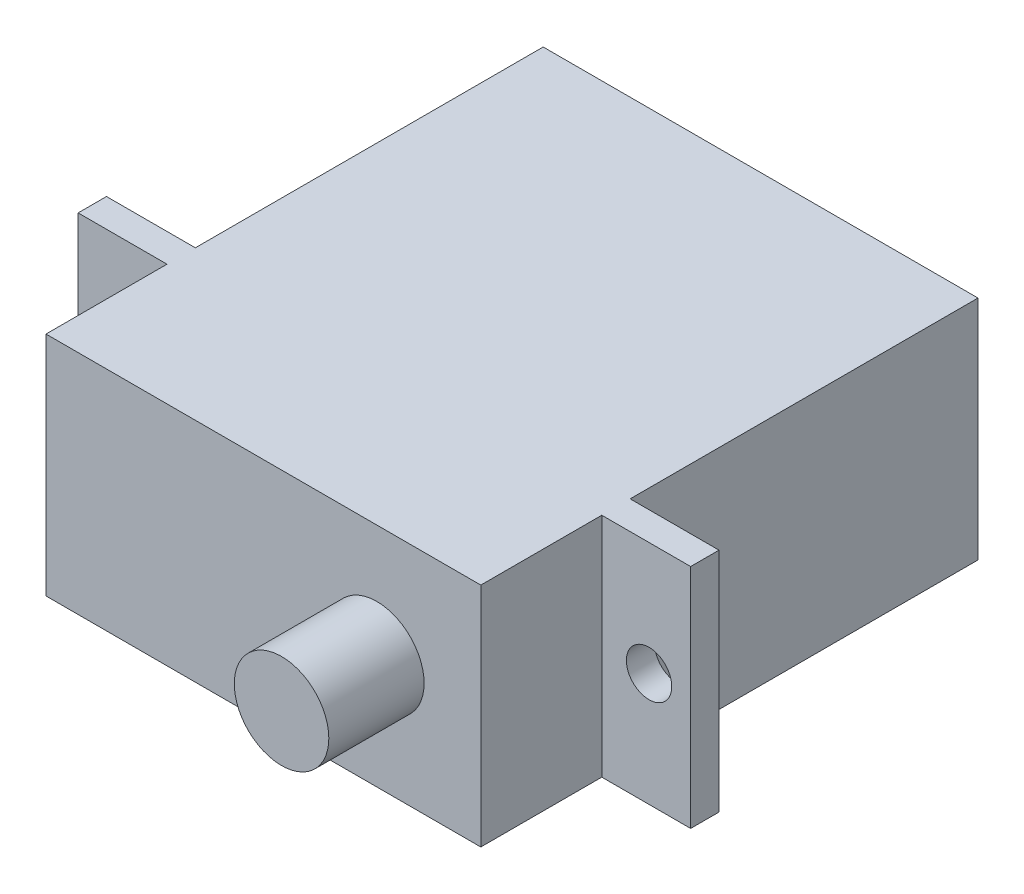
ISO-10303-21;
HEADER;
FILE_DESCRIPTION(('STEP AP214'),'2;1');
FILE_NAME('part.step','',(''),(''),'','','');
FILE_SCHEMA(('AUTOMOTIVE_DESIGN { 1 0 10303 214 1 1 1 1 }'));
ENDSEC;
DATA;
#1=APPLICATION_CONTEXT('core data for automotive mechanical design processes');
#2=APPLICATION_PROTOCOL_DEFINITION('international standard','automotive_design',2000,#1);
#3=PRODUCT_CONTEXT('',#1,'mechanical');
#4=PRODUCT('Part','Part','',(#3));
#5=PRODUCT_RELATED_PRODUCT_CATEGORY('part','',(#4));
#6=PRODUCT_DEFINITION_FORMATION('','',#4);
#7=PRODUCT_DEFINITION_CONTEXT('part definition',#1,'design');
#8=PRODUCT_DEFINITION('design','',#6,#7);
#9=PRODUCT_DEFINITION_SHAPE('','',#8);
#10=(LENGTH_UNIT() NAMED_UNIT(*) SI_UNIT(.MILLI.,.METRE.));
#11=(NAMED_UNIT(*) PLANE_ANGLE_UNIT() SI_UNIT($,.RADIAN.));
#12=(NAMED_UNIT(*) SI_UNIT($,.STERADIAN.) SOLID_ANGLE_UNIT());
#13=UNCERTAINTY_MEASURE_WITH_UNIT(LENGTH_MEASURE(1.E-05),#10,'distance_accuracy_value','');
#14=(GEOMETRIC_REPRESENTATION_CONTEXT(3) GLOBAL_UNCERTAINTY_ASSIGNED_CONTEXT((#13)) GLOBAL_UNIT_ASSIGNED_CONTEXT((#10,
#11,#12)) REPRESENTATION_CONTEXT('',''));
#15=CARTESIAN_POINT('',(0.,0.,0.));
#16=DIRECTION('',(0.,0.,1.));
#17=DIRECTION('',(1.,0.,0.));
#18=AXIS2_PLACEMENT_3D('',#15,#16,#17);
#19=CARTESIAN_POINT('',(0.,0.,1.5));
#20=DIRECTION('',(0.,0.,1.));
#21=DIRECTION('',(1.,0.,0.));
#22=AXIS2_PLACEMENT_3D('',#19,#20,#21);
#23=PLANE('',#22);
#24=DIRECTION('',(0.,1.,0.));
#25=VECTOR('',#24,1.);
#26=CARTESIAN_POINT('',(11.5,0.,1.5));
#27=LINE('',#26,#25);
#28=CARTESIAN_POINT('',(11.5,-6.,1.5));
#29=VERTEX_POINT('',#28);
#30=CARTESIAN_POINT('',(11.5,6.,1.5));
#31=VERTEX_POINT('',#30);
#32=EDGE_CURVE('E129',#29,#31,#27,.T.);
#33=ORIENTED_EDGE('',*,*,#32,.F.);
#34=DIRECTION('',(1.,0.,0.));
#35=VECTOR('',#34,1.);
#36=CARTESIAN_POINT('',(-16.2,-6.,1.5));
#37=LINE('',#36,#35);
#38=CARTESIAN_POINT('',(16.2,-6.,1.5));
#39=VERTEX_POINT('',#38);
#40=EDGE_CURVE('E204',#29,#39,#37,.T.);
#41=ORIENTED_EDGE('',*,*,#40,.T.);
#42=DIRECTION('',(0.,1.,0.));
#43=VECTOR('',#42,1.);
#44=CARTESIAN_POINT('',(16.2,6.,1.5));
#45=LINE('',#44,#43);
#46=CARTESIAN_POINT('',(16.2,6.,1.5));
#47=VERTEX_POINT('',#46);
#48=EDGE_CURVE('E197',#39,#47,#45,.T.);
#49=ORIENTED_EDGE('',*,*,#48,.T.);
#50=DIRECTION('',(-1.,0.,0.));
#51=VECTOR('',#50,1.);
#52=CARTESIAN_POINT('',(-16.2,6.,1.5));
#53=LINE('',#52,#51);
#54=EDGE_CURVE('E49',#47,#31,#53,.T.);
#55=ORIENTED_EDGE('',*,*,#54,.T.);
#56=EDGE_LOOP('',(#33,#41,#49,#55));
#57=FACE_BOUND('',#56,.T.);
#58=CARTESIAN_POINT('',(14.,0.,1.5));
#59=DIRECTION('',(0.,0.,1.));
#60=DIRECTION('',(-1.,0.,0.));
#61=AXIS2_PLACEMENT_3D('',#58,#59,#60);
#62=CIRCLE('',#61,1.2);
#63=CARTESIAN_POINT('',(12.8,0.,1.5));
#64=VERTEX_POINT('',#63);
#65=EDGE_CURVE('E185',#64,#64,#62,.T.);
#66=ORIENTED_EDGE('',*,*,#65,.F.);
#67=EDGE_LOOP('',(#66));
#68=FACE_BOUND('',#67,.T.);
#69=ADVANCED_FACE('F34',(#57,#68),#23,.T.);
#70=CARTESIAN_POINT('',(0.,0.,0.));
#71=DIRECTION('',(0.,0.,1.));
#72=DIRECTION('',(1.,0.,0.));
#73=AXIS2_PLACEMENT_3D('',#70,#71,#72);
#74=PLANE('',#73);
#75=CARTESIAN_POINT('',(14.,0.,0.));
#76=DIRECTION('',(0.,0.,1.));
#77=DIRECTION('',(-1.,0.,0.));
#78=AXIS2_PLACEMENT_3D('',#75,#76,#77);
#79=CIRCLE('',#78,1.2);
#80=CARTESIAN_POINT('',(12.8,0.,0.));
#81=VERTEX_POINT('',#80);
#82=EDGE_CURVE('E184',#81,#81,#79,.T.);
#83=ORIENTED_EDGE('',*,*,#82,.T.);
#84=EDGE_LOOP('',(#83));
#85=FACE_BOUND('',#84,.T.);
#86=DIRECTION('',(1.,0.,0.));
#87=VECTOR('',#86,1.);
#88=CARTESIAN_POINT('',(-16.2,-6.,0.));
#89=LINE('',#88,#87);
#90=CARTESIAN_POINT('',(11.5,-6.,0.));
#91=VERTEX_POINT('',#90);
#92=CARTESIAN_POINT('',(16.2,-6.,0.));
#93=VERTEX_POINT('',#92);
#94=EDGE_CURVE('E216',#91,#93,#89,.T.);
#95=ORIENTED_EDGE('',*,*,#94,.F.);
#96=DIRECTION('',(0.,1.,0.));
#97=VECTOR('',#96,1.);
#98=CARTESIAN_POINT('',(11.5,0.,0.));
#99=LINE('',#98,#97);
#100=CARTESIAN_POINT('',(11.5,6.,0.));
#101=VERTEX_POINT('',#100);
#102=EDGE_CURVE('E180',#91,#101,#99,.T.);
#103=ORIENTED_EDGE('',*,*,#102,.T.);
#104=DIRECTION('',(-1.,0.,0.));
#105=VECTOR('',#104,1.);
#106=CARTESIAN_POINT('',(-16.2,6.,0.));
#107=LINE('',#106,#105);
#108=CARTESIAN_POINT('',(16.2,6.,0.));
#109=VERTEX_POINT('',#108);
#110=EDGE_CURVE('E211',#109,#101,#107,.T.);
#111=ORIENTED_EDGE('',*,*,#110,.F.);
#112=DIRECTION('',(0.,1.,0.));
#113=VECTOR('',#112,1.);
#114=CARTESIAN_POINT('',(16.2,6.,0.));
#115=LINE('',#114,#113);
#116=EDGE_CURVE('E194',#93,#109,#115,.T.);
#117=ORIENTED_EDGE('',*,*,#116,.F.);
#118=EDGE_LOOP('',(#95,#103,#111,#117));
#119=FACE_BOUND('',#118,.T.);
#120=ADVANCED_FACE('F255',(#85,#119),#74,.F.);
#121=DIRECTION('',(0.,-1.,0.));
#122=VECTOR('',#121,1.);
#123=CARTESIAN_POINT('',(-11.5,0.,1.5));
#124=LINE('',#123,#122);
#125=CARTESIAN_POINT('',(-11.5,6.,1.49999999999999));
#126=VERTEX_POINT('',#125);
#127=CARTESIAN_POINT('',(-11.5,-6.,1.5));
#128=VERTEX_POINT('',#127);
#129=EDGE_CURVE('E177',#126,#128,#124,.T.);
#130=ORIENTED_EDGE('',*,*,#129,.F.);
#131=CARTESIAN_POINT('',(-16.2,6.,1.5));
#132=VERTEX_POINT('',#131);
#133=EDGE_CURVE('E199',#126,#132,#53,.T.);
#134=ORIENTED_EDGE('',*,*,#133,.T.);
#135=DIRECTION('',(0.,-1.,0.));
#136=VECTOR('',#135,1.);
#137=CARTESIAN_POINT('',(-16.2,6.,1.5));
#138=LINE('',#137,#136);
#139=CARTESIAN_POINT('',(-16.2,-6.,1.5));
#140=VERTEX_POINT('',#139);
#141=EDGE_CURVE('E202',#132,#140,#138,.T.);
#142=ORIENTED_EDGE('',*,*,#141,.T.);
#143=EDGE_CURVE('E205',#140,#128,#37,.T.);
#144=ORIENTED_EDGE('',*,*,#143,.T.);
#145=EDGE_LOOP('',(#130,#134,#142,#144));
#146=FACE_BOUND('',#145,.T.);
#147=CARTESIAN_POINT('',(-14.,0.,1.5));
#148=DIRECTION('',(0.,0.,1.));
#149=DIRECTION('',(1.,0.,0.));
#150=AXIS2_PLACEMENT_3D('',#147,#148,#149);
#151=CIRCLE('',#150,1.2);
#152=CARTESIAN_POINT('',(-12.8,0.,1.5));
#153=VERTEX_POINT('',#152);
#154=EDGE_CURVE('E191',#153,#153,#151,.T.);
#155=ORIENTED_EDGE('',*,*,#154,.F.);
#156=EDGE_LOOP('',(#155));
#157=FACE_BOUND('',#156,.T.);
#158=ADVANCED_FACE('F241',(#146,#157),#23,.T.);
#159=CARTESIAN_POINT('',(-11.5,6.,0.));
#160=VERTEX_POINT('',#159);
#161=CARTESIAN_POINT('',(-16.2,6.,0.));
#162=VERTEX_POINT('',#161);
#163=EDGE_CURVE('E210',#160,#162,#107,.T.);
#164=ORIENTED_EDGE('',*,*,#163,.F.);
#165=DIRECTION('',(0.,-1.,0.));
#166=VECTOR('',#165,1.);
#167=CARTESIAN_POINT('',(-11.5,0.,0.));
#168=LINE('',#167,#166);
#169=CARTESIAN_POINT('',(-11.5,-6.,0.));
#170=VERTEX_POINT('',#169);
#171=EDGE_CURVE('E169',#160,#170,#168,.T.);
#172=ORIENTED_EDGE('',*,*,#171,.T.);
#173=CARTESIAN_POINT('',(-16.2,-6.,0.));
#174=VERTEX_POINT('',#173);
#175=EDGE_CURVE('E200',#174,#170,#89,.T.);
#176=ORIENTED_EDGE('',*,*,#175,.F.);
#177=DIRECTION('',(0.,-1.,0.));
#178=VECTOR('',#177,1.);
#179=CARTESIAN_POINT('',(-16.2,6.,0.));
#180=LINE('',#179,#178);
#181=EDGE_CURVE('E214',#162,#174,#180,.T.);
#182=ORIENTED_EDGE('',*,*,#181,.F.);
#183=EDGE_LOOP('',(#164,#172,#176,#182));
#184=FACE_BOUND('',#183,.T.);
#185=CARTESIAN_POINT('',(-14.,0.,0.));
#186=DIRECTION('',(0.,0.,1.));
#187=DIRECTION('',(1.,0.,0.));
#188=AXIS2_PLACEMENT_3D('',#185,#186,#187);
#189=CIRCLE('',#188,1.2);
#190=CARTESIAN_POINT('',(-12.8,0.,0.));
#191=VERTEX_POINT('',#190);
#192=EDGE_CURVE('E188',#191,#191,#189,.T.);
#193=ORIENTED_EDGE('',*,*,#192,.T.);
#194=EDGE_LOOP('',(#193));
#195=FACE_BOUND('',#194,.T.);
#196=ADVANCED_FACE('F233',(#184,#195),#74,.F.);
#197=CARTESIAN_POINT('',(16.2,6.,1.5));
#198=DIRECTION('',(-1.,0.,0.));
#199=DIRECTION('',(0.,0.,1.));
#200=AXIS2_PLACEMENT_3D('',#197,#198,#199);
#201=PLANE('',#200);
#202=ORIENTED_EDGE('',*,*,#116,.T.);
#203=DIRECTION('',(0.,0.,-1.));
#204=VECTOR('',#203,1.);
#205=CARTESIAN_POINT('',(16.2,6.,1.5));
#206=LINE('',#205,#204);
#207=EDGE_CURVE('E11',#47,#109,#206,.T.);
#208=ORIENTED_EDGE('',*,*,#207,.F.);
#209=ORIENTED_EDGE('',*,*,#48,.F.);
#210=DIRECTION('',(0.,0.,-1.));
#211=VECTOR('',#210,1.);
#212=CARTESIAN_POINT('',(16.2,-6.,1.5));
#213=LINE('',#212,#211);
#214=EDGE_CURVE('E207',#39,#93,#213,.T.);
#215=ORIENTED_EDGE('',*,*,#214,.T.);
#216=EDGE_LOOP('',(#202,#208,#209,#215));
#217=FACE_BOUND('',#216,.T.);
#218=ADVANCED_FACE('F36',(#217),#201,.F.);
#219=CARTESIAN_POINT('',(-16.2,6.,1.5));
#220=DIRECTION('',(0.,-1.,0.));
#221=DIRECTION('',(0.,0.,-1.));
#222=AXIS2_PLACEMENT_3D('',#219,#220,#221);
#223=PLANE('',#222);
#224=ORIENTED_EDGE('',*,*,#133,.F.);
#225=DIRECTION('',(0.,0.,1.));
#226=VECTOR('',#225,1.);
#227=CARTESIAN_POINT('',(-11.5,6.,-18.4));
#228=LINE('',#227,#226);
#229=CARTESIAN_POINT('',(-11.5,6.,7.9));
#230=VERTEX_POINT('',#229);
#231=EDGE_CURVE('E137',#126,#230,#228,.T.);
#232=ORIENTED_EDGE('',*,*,#231,.T.);
#233=DIRECTION('',(-1.,0.,0.));
#234=VECTOR('',#233,1.);
#235=CARTESIAN_POINT('',(-11.5,6.,7.9));
#236=LINE('',#235,#234);
#237=CARTESIAN_POINT('',(11.5,6.,7.9));
#238=VERTEX_POINT('',#237);
#239=EDGE_CURVE('E134',#238,#230,#236,.T.);
#240=ORIENTED_EDGE('',*,*,#239,.F.);
#241=DIRECTION('',(0.,0.,1.));
#242=VECTOR('',#241,1.);
#243=CARTESIAN_POINT('',(11.5,6.,-18.4));
#244=LINE('',#243,#242);
#245=EDGE_CURVE('E123',#31,#238,#244,.T.);
#246=ORIENTED_EDGE('',*,*,#245,.F.);
#247=ORIENTED_EDGE('',*,*,#54,.F.);
#248=ORIENTED_EDGE('',*,*,#207,.T.);
#249=ORIENTED_EDGE('',*,*,#110,.T.);
#250=CARTESIAN_POINT('',(11.5,6.,-18.4));
#251=VERTEX_POINT('',#250);
#252=EDGE_CURVE('E130',#251,#101,#244,.T.);
#253=ORIENTED_EDGE('',*,*,#252,.F.);
#254=DIRECTION('',(-1.,0.,0.));
#255=VECTOR('',#254,1.);
#256=CARTESIAN_POINT('',(-11.5,6.,-18.4));
#257=LINE('',#256,#255);
#258=CARTESIAN_POINT('',(-11.5,6.,-18.4));
#259=VERTEX_POINT('',#258);
#260=EDGE_CURVE('E159',#251,#259,#257,.T.);
#261=ORIENTED_EDGE('',*,*,#260,.T.);
#262=EDGE_CURVE('E57',#259,#160,#228,.T.);
#263=ORIENTED_EDGE('',*,*,#262,.T.);
#264=ORIENTED_EDGE('',*,*,#163,.T.);
#265=DIRECTION('',(0.,0.,-1.));
#266=VECTOR('',#265,1.);
#267=CARTESIAN_POINT('',(-16.2,6.,1.5));
#268=LINE('',#267,#266);
#269=EDGE_CURVE('E42',#132,#162,#268,.T.);
#270=ORIENTED_EDGE('',*,*,#269,.F.);
#271=EDGE_LOOP('',(#224,#232,#240,#246,#247,#248,#249,#253,#261,#263,#264,#270));
#272=FACE_BOUND('',#271,.T.);
#273=ADVANCED_FACE('F135',(#272),#223,.F.);
#274=CARTESIAN_POINT('',(-16.2,6.,1.5));
#275=DIRECTION('',(1.,0.,0.));
#276=DIRECTION('',(0.,0.,-1.));
#277=AXIS2_PLACEMENT_3D('',#274,#275,#276);
#278=PLANE('',#277);
#279=ORIENTED_EDGE('',*,*,#181,.T.);
#280=DIRECTION('',(0.,0.,-1.));
#281=VECTOR('',#280,1.);
#282=CARTESIAN_POINT('',(-16.2,-6.,1.5));
#283=LINE('',#282,#281);
#284=EDGE_CURVE('E221',#140,#174,#283,.T.);
#285=ORIENTED_EDGE('',*,*,#284,.F.);
#286=ORIENTED_EDGE('',*,*,#141,.F.);
#287=ORIENTED_EDGE('',*,*,#269,.T.);
#288=EDGE_LOOP('',(#279,#285,#286,#287));
#289=FACE_BOUND('',#288,.T.);
#290=ADVANCED_FACE('F228',(#289),#278,.F.);
#291=CARTESIAN_POINT('',(-16.2,-6.,1.5));
#292=DIRECTION('',(0.,1.,0.));
#293=DIRECTION('',(0.,0.,1.));
#294=AXIS2_PLACEMENT_3D('',#291,#292,#293);
#295=PLANE('',#294);
#296=ORIENTED_EDGE('',*,*,#175,.T.);
#297=DIRECTION('',(0.,0.,1.));
#298=VECTOR('',#297,1.);
#299=CARTESIAN_POINT('',(-11.5,-6.,-18.4));
#300=LINE('',#299,#298);
#301=CARTESIAN_POINT('',(-11.5,-6.,-18.4));
#302=VERTEX_POINT('',#301);
#303=EDGE_CURVE('E171',#302,#170,#300,.T.);
#304=ORIENTED_EDGE('',*,*,#303,.F.);
#305=DIRECTION('',(1.,0.,0.));
#306=VECTOR('',#305,1.);
#307=CARTESIAN_POINT('',(-11.5,-6.,-18.4));
#308=LINE('',#307,#306);
#309=CARTESIAN_POINT('',(11.5,-6.,-18.4));
#310=VERTEX_POINT('',#309);
#311=EDGE_CURVE('E131',#302,#310,#308,.T.);
#312=ORIENTED_EDGE('',*,*,#311,.T.);
#313=DIRECTION('',(0.,0.,1.));
#314=VECTOR('',#313,1.);
#315=CARTESIAN_POINT('',(11.5,-6.,-18.4));
#316=LINE('',#315,#314);
#317=EDGE_CURVE('E166',#310,#91,#316,.T.);
#318=ORIENTED_EDGE('',*,*,#317,.T.);
#319=ORIENTED_EDGE('',*,*,#94,.T.);
#320=ORIENTED_EDGE('',*,*,#214,.F.);
#321=ORIENTED_EDGE('',*,*,#40,.F.);
#322=CARTESIAN_POINT('',(11.5,-6.,7.9));
#323=VERTEX_POINT('',#322);
#324=EDGE_CURVE('E170',#29,#323,#316,.T.);
#325=ORIENTED_EDGE('',*,*,#324,.T.);
#326=DIRECTION('',(1.,0.,0.));
#327=VECTOR('',#326,1.);
#328=CARTESIAN_POINT('',(-11.5,-6.,7.9));
#329=LINE('',#328,#327);
#330=CARTESIAN_POINT('',(-11.5,-6.,7.9));
#331=VERTEX_POINT('',#330);
#332=EDGE_CURVE('E146',#331,#323,#329,.T.);
#333=ORIENTED_EDGE('',*,*,#332,.F.);
#334=EDGE_CURVE('E173',#128,#331,#300,.T.);
#335=ORIENTED_EDGE('',*,*,#334,.F.);
#336=ORIENTED_EDGE('',*,*,#143,.F.);
#337=ORIENTED_EDGE('',*,*,#284,.T.);
#338=EDGE_LOOP('',(#296,#304,#312,#318,#319,#320,#321,#325,#333,#335,#336,#337));
#339=FACE_BOUND('',#338,.T.);
#340=ADVANCED_FACE('F236',(#339),#295,.F.);
#341=CARTESIAN_POINT('',(-14.,0.,1.5));
#342=DIRECTION('',(0.,0.,-1.));
#343=DIRECTION('',(-1.,0.,0.));
#344=AXIS2_PLACEMENT_3D('',#341,#342,#343);
#345=CYLINDRICAL_SURFACE('',#344,1.2);
#346=ORIENTED_EDGE('',*,*,#154,.T.);
#347=EDGE_LOOP('',(#346));
#348=FACE_BOUND('',#347,.T.);
#349=ORIENTED_EDGE('',*,*,#192,.F.);
#350=EDGE_LOOP('',(#349));
#351=FACE_BOUND('',#350,.T.);
#352=ADVANCED_FACE('F293',(#348,#351),#345,.F.);
#353=CARTESIAN_POINT('',(14.,0.,1.5));
#354=DIRECTION('',(0.,0.,-1.));
#355=DIRECTION('',(-1.,0.,0.));
#356=AXIS2_PLACEMENT_3D('',#353,#354,#355);
#357=CYLINDRICAL_SURFACE('',#356,1.2);
#358=ORIENTED_EDGE('',*,*,#65,.T.);
#359=EDGE_LOOP('',(#358));
#360=FACE_BOUND('',#359,.T.);
#361=ORIENTED_EDGE('',*,*,#82,.F.);
#362=EDGE_LOOP('',(#361));
#363=FACE_BOUND('',#362,.T.);
#364=ADVANCED_FACE('F272',(#360,#363),#357,.F.);
#365=CARTESIAN_POINT('',(0.,0.,-18.4));
#366=DIRECTION('',(0.,0.,1.));
#367=DIRECTION('',(1.,0.,0.));
#368=AXIS2_PLACEMENT_3D('',#365,#366,#367);
#369=PLANE('',#368);
#370=DIRECTION('',(0.,1.,0.));
#371=VECTOR('',#370,1.);
#372=CARTESIAN_POINT('',(11.5,6.,-18.4));
#373=LINE('',#372,#371);
#374=EDGE_CURVE('E156',#310,#251,#373,.T.);
#375=ORIENTED_EDGE('',*,*,#374,.F.);
#376=ORIENTED_EDGE('',*,*,#311,.F.);
#377=DIRECTION('',(0.,-1.,0.));
#378=VECTOR('',#377,1.);
#379=CARTESIAN_POINT('',(-11.5,6.,-18.4));
#380=LINE('',#379,#378);
#381=EDGE_CURVE('E161',#259,#302,#380,.T.);
#382=ORIENTED_EDGE('',*,*,#381,.F.);
#383=ORIENTED_EDGE('',*,*,#260,.F.);
#384=EDGE_LOOP('',(#375,#376,#382,#383));
#385=FACE_BOUND('',#384,.T.);
#386=ADVANCED_FACE('F262',(#385),#369,.F.);
#387=CARTESIAN_POINT('',(-11.5,6.,-18.4));
#388=DIRECTION('',(-1.,0.,0.));
#389=DIRECTION('',(0.,0.,1.));
#390=AXIS2_PLACEMENT_3D('',#387,#388,#389);
#391=PLANE('',#390);
#392=ORIENTED_EDGE('',*,*,#171,.F.);
#393=ORIENTED_EDGE('',*,*,#262,.F.);
#394=ORIENTED_EDGE('',*,*,#381,.T.);
#395=ORIENTED_EDGE('',*,*,#303,.T.);
#396=EDGE_LOOP('',(#392,#393,#394,#395));
#397=FACE_BOUND('',#396,.T.);
#398=ADVANCED_FACE('F264',(#397),#391,.T.);
#399=CARTESIAN_POINT('',(11.5,6.,-18.4));
#400=DIRECTION('',(1.,0.,0.));
#401=DIRECTION('',(0.,0.,-1.));
#402=AXIS2_PLACEMENT_3D('',#399,#400,#401);
#403=PLANE('',#402);
#404=ORIENTED_EDGE('',*,*,#102,.F.);
#405=ORIENTED_EDGE('',*,*,#317,.F.);
#406=ORIENTED_EDGE('',*,*,#374,.T.);
#407=ORIENTED_EDGE('',*,*,#252,.T.);
#408=EDGE_LOOP('',(#404,#405,#406,#407));
#409=FACE_BOUND('',#408,.T.);
#410=ADVANCED_FACE('F257',(#409),#403,.T.);
#411=ORIENTED_EDGE('',*,*,#324,.F.);
#412=ORIENTED_EDGE('',*,*,#32,.T.);
#413=ORIENTED_EDGE('',*,*,#245,.T.);
#414=DIRECTION('',(0.,1.,0.));
#415=VECTOR('',#414,1.);
#416=CARTESIAN_POINT('',(11.5,6.,7.9));
#417=LINE('',#416,#415);
#418=EDGE_CURVE('E128',#323,#238,#417,.T.);
#419=ORIENTED_EDGE('',*,*,#418,.F.);
#420=EDGE_LOOP('',(#411,#412,#413,#419));
#421=FACE_BOUND('',#420,.T.);
#422=ADVANCED_FACE('F126',(#421),#403,.T.);
#423=ORIENTED_EDGE('',*,*,#231,.F.);
#424=ORIENTED_EDGE('',*,*,#129,.T.);
#425=ORIENTED_EDGE('',*,*,#334,.T.);
#426=DIRECTION('',(0.,-1.,0.));
#427=VECTOR('',#426,1.);
#428=CARTESIAN_POINT('',(-11.5,6.,7.9));
#429=LINE('',#428,#427);
#430=EDGE_CURVE('E141',#230,#331,#429,.T.);
#431=ORIENTED_EDGE('',*,*,#430,.F.);
#432=EDGE_LOOP('',(#423,#424,#425,#431));
#433=FACE_BOUND('',#432,.T.);
#434=ADVANCED_FACE('F244',(#433),#391,.T.);
#435=CARTESIAN_POINT('',(0.,0.,7.9));
#436=DIRECTION('',(0.,0.,1.));
#437=DIRECTION('',(1.,0.,0.));
#438=AXIS2_PLACEMENT_3D('',#435,#436,#437);
#439=PLANE('',#438);
#440=CARTESIAN_POINT('',(6.,0.,7.9));
#441=DIRECTION('',(0.,0.,1.));
#442=DIRECTION('',(1.,0.,0.));
#443=AXIS2_PLACEMENT_3D('',#440,#441,#442);
#444=CIRCLE('',#443,2.5);
#445=CARTESIAN_POINT('',(8.5,0.,7.9));
#446=VERTEX_POINT('',#445);
#447=EDGE_CURVE('E150',#446,#446,#444,.T.);
#448=ORIENTED_EDGE('',*,*,#447,.F.);
#449=EDGE_LOOP('',(#448));
#450=FACE_BOUND('',#449,.T.);
#451=ORIENTED_EDGE('',*,*,#418,.T.);
#452=ORIENTED_EDGE('',*,*,#239,.T.);
#453=ORIENTED_EDGE('',*,*,#430,.T.);
#454=ORIENTED_EDGE('',*,*,#332,.T.);
#455=EDGE_LOOP('',(#451,#452,#453,#454));
#456=FACE_BOUND('',#455,.T.);
#457=ADVANCED_FACE('F144',(#450,#456),#439,.T.);
#458=CARTESIAN_POINT('',(6.,0.,12.94));
#459=DIRECTION('',(0.,0.,-1.));
#460=DIRECTION('',(-1.,0.,0.));
#461=AXIS2_PLACEMENT_3D('',#458,#459,#460);
#462=CYLINDRICAL_SURFACE('',#461,2.5);
#463=CARTESIAN_POINT('',(6.,0.,12.94));
#464=DIRECTION('',(0.,0.,1.));
#465=DIRECTION('',(1.,0.,0.));
#466=AXIS2_PLACEMENT_3D('',#463,#464,#465);
#467=CIRCLE('',#466,2.5);
#468=CARTESIAN_POINT('',(8.5,0.,12.94));
#469=VERTEX_POINT('',#468);
#470=EDGE_CURVE('E147',#469,#469,#467,.T.);
#471=ORIENTED_EDGE('',*,*,#470,.F.);
#472=EDGE_LOOP('',(#471));
#473=FACE_BOUND('',#472,.T.);
#474=ORIENTED_EDGE('',*,*,#447,.T.);
#475=EDGE_LOOP('',(#474));
#476=FACE_BOUND('',#475,.T.);
#477=ADVANCED_FACE('F357',(#473,#476),#462,.T.);
#478=CARTESIAN_POINT('',(6.,0.,12.94));
#479=DIRECTION('',(0.,0.,1.));
#480=DIRECTION('',(1.,0.,0.));
#481=AXIS2_PLACEMENT_3D('',#478,#479,#480);
#482=PLANE('',#481);
#483=ORIENTED_EDGE('',*,*,#470,.T.);
#484=EDGE_LOOP('',(#483));
#485=FACE_BOUND('',#484,.T.);
#486=ADVANCED_FACE('F367',(#485),#482,.T.);
#487=CLOSED_SHELL('',(#69,#120,#158,#196,#218,#273,#290,#340,#352,#364,#386,#398,#410,#422,#434,
#457,#477,#486));
#488=MANIFOLD_SOLID_BREP('B2',#487);
#489=ADVANCED_BREP_SHAPE_REPRESENTATION('',(#18,#488),#14);
#490=SHAPE_DEFINITION_REPRESENTATION(#9,#489);
ENDSEC;
END-ISO-10303-21;
